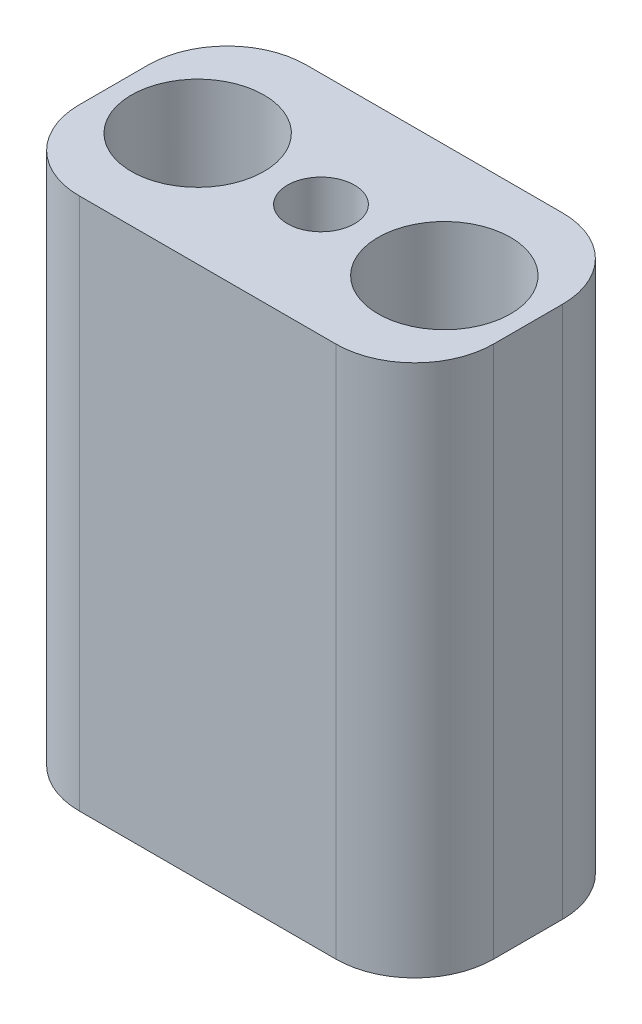
ISO-10303-21;
HEADER;
FILE_DESCRIPTION(('STEP AP214'),'2;1');
FILE_NAME('part.step','',(''),(''),'','','');
FILE_SCHEMA(('AUTOMOTIVE_DESIGN { 1 0 10303 214 1 1 1 1 }'));
ENDSEC;
DATA;
#1=APPLICATION_CONTEXT('core data for automotive mechanical design processes');
#2=APPLICATION_PROTOCOL_DEFINITION('international standard','automotive_design',2000,#1);
#3=PRODUCT_CONTEXT('',#1,'mechanical');
#4=PRODUCT('Part','Part','',(#3));
#5=PRODUCT_RELATED_PRODUCT_CATEGORY('part','',(#4));
#6=PRODUCT_DEFINITION_FORMATION('','',#4);
#7=PRODUCT_DEFINITION_CONTEXT('part definition',#1,'design');
#8=PRODUCT_DEFINITION('design','',#6,#7);
#9=PRODUCT_DEFINITION_SHAPE('','',#8);
#10=(LENGTH_UNIT() NAMED_UNIT(*) SI_UNIT(.MILLI.,.METRE.));
#11=(NAMED_UNIT(*) PLANE_ANGLE_UNIT() SI_UNIT($,.RADIAN.));
#12=(NAMED_UNIT(*) SI_UNIT($,.STERADIAN.) SOLID_ANGLE_UNIT());
#13=UNCERTAINTY_MEASURE_WITH_UNIT(LENGTH_MEASURE(1.E-05),#10,'distance_accuracy_value','');
#14=(GEOMETRIC_REPRESENTATION_CONTEXT(3) GLOBAL_UNCERTAINTY_ASSIGNED_CONTEXT((#13)) GLOBAL_UNIT_ASSIGNED_CONTEXT((#10,
#11,#12)) REPRESENTATION_CONTEXT('',''));
#15=CARTESIAN_POINT('',(0.,0.,0.));
#16=DIRECTION('',(0.,0.,1.));
#17=DIRECTION('',(1.,0.,0.));
#18=AXIS2_PLACEMENT_3D('',#15,#16,#17);
#19=CARTESIAN_POINT('',(-21.,0.,23.));
#20=DIRECTION('',(1.,0.,0.));
#21=DIRECTION('',(0.,0.,-1.));
#22=AXIS2_PLACEMENT_3D('',#19,#20,#21);
#23=PLANE('',#22);
#24=DIRECTION('',(0.,0.,-1.));
#25=VECTOR('',#24,1.);
#26=CARTESIAN_POINT('',(-21.,0.,23.));
#27=LINE('',#26,#25);
#28=CARTESIAN_POINT('',(-21.,0.,15.));
#29=VERTEX_POINT('',#28);
#30=CARTESIAN_POINT('',(-21.,0.,8.));
#31=VERTEX_POINT('',#30);
#32=EDGE_CURVE('E145',#29,#31,#27,.T.);
#33=ORIENTED_EDGE('',*,*,#32,.F.);
#34=DIRECTION('',(0.,-1.,0.));
#35=VECTOR('',#34,1.);
#36=CARTESIAN_POINT('',(-21.,0.,15.));
#37=LINE('',#36,#35);
#38=CARTESIAN_POINT('',(-21.,54.,15.));
#39=VERTEX_POINT('',#38);
#40=EDGE_CURVE('E165',#29,#39,#37,.F.);
#41=ORIENTED_EDGE('',*,*,#40,.T.);
#42=DIRECTION('',(0.,0.,-1.));
#43=VECTOR('',#42,1.);
#44=CARTESIAN_POINT('',(-21.,54.,23.));
#45=LINE('',#44,#43);
#46=CARTESIAN_POINT('',(-21.,54.,8.));
#47=VERTEX_POINT('',#46);
#48=EDGE_CURVE('E134',#39,#47,#45,.T.);
#49=ORIENTED_EDGE('',*,*,#48,.T.);
#50=DIRECTION('',(0.,-1.,0.));
#51=VECTOR('',#50,1.);
#52=CARTESIAN_POINT('',(-21.,0.,8.));
#53=LINE('',#52,#51);
#54=EDGE_CURVE('E162',#47,#31,#53,.T.);
#55=ORIENTED_EDGE('',*,*,#54,.T.);
#56=EDGE_LOOP('',(#33,#41,#49,#55));
#57=FACE_BOUND('',#56,.T.);
#58=ADVANCED_FACE('F41',(#57),#23,.F.);
#59=CARTESIAN_POINT('',(-21.,0.,23.));
#60=DIRECTION('',(0.,1.,0.));
#61=DIRECTION('',(0.,0.,1.));
#62=AXIS2_PLACEMENT_3D('',#59,#60,#61);
#63=PLANE('',#62);
#64=CARTESIAN_POINT('',(12.5,0.,11.5));
#65=DIRECTION('',(0.,1.,0.));
#66=DIRECTION('',(0.,0.,1.));
#67=AXIS2_PLACEMENT_3D('',#64,#65,#66);
#68=CIRCLE('',#67,3.29999999999999);
#69=CARTESIAN_POINT('',(12.5,0.,14.8));
#70=VERTEX_POINT('',#69);
#71=EDGE_CURVE('E278',#70,#70,#68,.T.);
#72=ORIENTED_EDGE('',*,*,#71,.T.);
#73=EDGE_LOOP('',(#72));
#74=FACE_BOUND('',#73,.T.);
#75=CARTESIAN_POINT('',(-12.5,0.,11.5));
#76=DIRECTION('',(0.,1.,0.));
#77=DIRECTION('',(0.,0.,1.));
#78=AXIS2_PLACEMENT_3D('',#75,#76,#77);
#79=CIRCLE('',#78,3.29999999999999);
#80=CARTESIAN_POINT('',(-12.5,0.,14.8));
#81=VERTEX_POINT('',#80);
#82=EDGE_CURVE('E125',#81,#81,#79,.T.);
#83=ORIENTED_EDGE('',*,*,#82,.T.);
#84=EDGE_LOOP('',(#83));
#85=FACE_BOUND('',#84,.T.);
#86=DIRECTION('',(1.,0.,0.));
#87=VECTOR('',#86,1.);
#88=CARTESIAN_POINT('',(-21.,0.,23.));
#89=LINE('',#88,#87);
#90=CARTESIAN_POINT('',(-13.,0.,23.));
#91=VERTEX_POINT('',#90);
#92=CARTESIAN_POINT('',(13.,0.,23.));
#93=VERTEX_POINT('',#92);
#94=EDGE_CURVE('E129',#91,#93,#89,.T.);
#95=ORIENTED_EDGE('',*,*,#94,.F.);
#96=CARTESIAN_POINT('',(-13.,0.,15.));
#97=DIRECTION('',(0.,1.,0.));
#98=DIRECTION('',(0.,0.,1.));
#99=AXIS2_PLACEMENT_3D('',#96,#97,#98);
#100=CIRCLE('',#99,8.);
#101=EDGE_CURVE('E160',#91,#29,#100,.F.);
#102=ORIENTED_EDGE('',*,*,#101,.T.);
#103=ORIENTED_EDGE('',*,*,#32,.T.);
#104=CARTESIAN_POINT('',(-13.,0.,8.));
#105=DIRECTION('',(0.,1.,0.));
#106=DIRECTION('',(0.,0.,1.));
#107=AXIS2_PLACEMENT_3D('',#104,#105,#106);
#108=CIRCLE('',#107,8.);
#109=CARTESIAN_POINT('',(-13.,0.,0.));
#110=VERTEX_POINT('',#109);
#111=EDGE_CURVE('E156',#31,#110,#108,.F.);
#112=ORIENTED_EDGE('',*,*,#111,.T.);
#113=DIRECTION('',(1.,0.,0.));
#114=VECTOR('',#113,1.);
#115=CARTESIAN_POINT('',(-21.,0.,0.));
#116=LINE('',#115,#114);
#117=CARTESIAN_POINT('',(13.,0.,0.));
#118=VERTEX_POINT('',#117);
#119=EDGE_CURVE('E118',#110,#118,#116,.T.);
#120=ORIENTED_EDGE('',*,*,#119,.T.);
#121=CARTESIAN_POINT('',(13.,0.,8.));
#122=DIRECTION('',(0.,1.,0.));
#123=DIRECTION('',(0.,0.,1.));
#124=AXIS2_PLACEMENT_3D('',#121,#122,#123);
#125=CIRCLE('',#124,8.);
#126=CARTESIAN_POINT('',(21.,0.,8.));
#127=VERTEX_POINT('',#126);
#128=EDGE_CURVE('E154',#118,#127,#125,.F.);
#129=ORIENTED_EDGE('',*,*,#128,.T.);
#130=DIRECTION('',(0.,0.,-1.));
#131=VECTOR('',#130,1.);
#132=CARTESIAN_POINT('',(21.,0.,23.));
#133=LINE('',#132,#131);
#134=CARTESIAN_POINT('',(21.,0.,15.));
#135=VERTEX_POINT('',#134);
#136=EDGE_CURVE('E142',#135,#127,#133,.T.);
#137=ORIENTED_EDGE('',*,*,#136,.F.);
#138=CARTESIAN_POINT('',(13.,0.,15.));
#139=DIRECTION('',(0.,1.,0.));
#140=DIRECTION('',(0.,0.,1.));
#141=AXIS2_PLACEMENT_3D('',#138,#139,#140);
#142=CIRCLE('',#141,8.);
#143=EDGE_CURVE('E158',#135,#93,#142,.F.);
#144=ORIENTED_EDGE('',*,*,#143,.T.);
#145=EDGE_LOOP('',(#95,#102,#103,#112,#120,#129,#137,#144));
#146=FACE_BOUND('',#145,.T.);
#147=ADVANCED_FACE('F183',(#74,#85,#146),#63,.F.);
#148=CARTESIAN_POINT('',(21.,0.,23.));
#149=DIRECTION('',(-1.,0.,0.));
#150=DIRECTION('',(0.,0.,1.));
#151=AXIS2_PLACEMENT_3D('',#148,#149,#150);
#152=PLANE('',#151);
#153=DIRECTION('',(0.,0.,-1.));
#154=VECTOR('',#153,1.);
#155=CARTESIAN_POINT('',(21.,54.,23.));
#156=LINE('',#155,#154);
#157=CARTESIAN_POINT('',(21.,54.,15.));
#158=VERTEX_POINT('',#157);
#159=CARTESIAN_POINT('',(21.,54.,8.));
#160=VERTEX_POINT('',#159);
#161=EDGE_CURVE('E140',#158,#160,#156,.T.);
#162=ORIENTED_EDGE('',*,*,#161,.F.);
#163=DIRECTION('',(0.,1.,0.));
#164=VECTOR('',#163,1.);
#165=CARTESIAN_POINT('',(21.,0.,15.));
#166=LINE('',#165,#164);
#167=EDGE_CURVE('E175',#158,#135,#166,.F.);
#168=ORIENTED_EDGE('',*,*,#167,.T.);
#169=ORIENTED_EDGE('',*,*,#136,.T.);
#170=DIRECTION('',(0.,1.,0.));
#171=VECTOR('',#170,1.);
#172=CARTESIAN_POINT('',(21.,54.,8.));
#173=LINE('',#172,#171);
#174=EDGE_CURVE('E173',#127,#160,#173,.T.);
#175=ORIENTED_EDGE('',*,*,#174,.T.);
#176=EDGE_LOOP('',(#162,#168,#169,#175));
#177=FACE_BOUND('',#176,.T.);
#178=ADVANCED_FACE('F186',(#177),#152,.F.);
#179=CARTESIAN_POINT('',(-21.,54.,23.));
#180=DIRECTION('',(0.,-1.,0.));
#181=DIRECTION('',(0.,0.,-1.));
#182=AXIS2_PLACEMENT_3D('',#179,#180,#181);
#183=PLANE('',#182);
#184=CARTESIAN_POINT('',(-12.5,54.,11.5));
#185=DIRECTION('',(0.,-1.,0.));
#186=DIRECTION('',(0.,0.,-1.));
#187=AXIS2_PLACEMENT_3D('',#184,#185,#186);
#188=CIRCLE('',#187,6.72);
#189=CARTESIAN_POINT('',(-12.5,54.,4.78));
#190=VERTEX_POINT('',#189);
#191=EDGE_CURVE('E261',#190,#190,#188,.T.);
#192=ORIENTED_EDGE('',*,*,#191,.T.);
#193=EDGE_LOOP('',(#192));
#194=FACE_BOUND('',#193,.T.);
#195=CARTESIAN_POINT('',(12.5,54.,11.5));
#196=DIRECTION('',(0.,-1.,0.));
#197=DIRECTION('',(0.,0.,-1.));
#198=AXIS2_PLACEMENT_3D('',#195,#196,#197);
#199=CIRCLE('',#198,6.72);
#200=CARTESIAN_POINT('',(12.5,54.,4.78));
#201=VERTEX_POINT('',#200);
#202=EDGE_CURVE('E266',#201,#201,#199,.T.);
#203=ORIENTED_EDGE('',*,*,#202,.T.);
#204=EDGE_LOOP('',(#203));
#205=FACE_BOUND('',#204,.T.);
#206=CARTESIAN_POINT('',(0.,54.,11.5));
#207=DIRECTION('',(0.,1.,0.));
#208=DIRECTION('',(0.,0.,1.));
#209=AXIS2_PLACEMENT_3D('',#206,#207,#208);
#210=CIRCLE('',#209,3.4);
#211=CARTESIAN_POINT('',(0.,54.,14.9));
#212=VERTEX_POINT('',#211);
#213=EDGE_CURVE('E119',#212,#212,#210,.T.);
#214=ORIENTED_EDGE('',*,*,#213,.F.);
#215=EDGE_LOOP('',(#214));
#216=FACE_BOUND('',#215,.T.);
#217=ORIENTED_EDGE('',*,*,#48,.F.);
#218=CARTESIAN_POINT('',(-13.,54.,15.));
#219=DIRECTION('',(0.,-1.,0.));
#220=DIRECTION('',(0.,0.,-1.));
#221=AXIS2_PLACEMENT_3D('',#218,#219,#220);
#222=CIRCLE('',#221,8.);
#223=CARTESIAN_POINT('',(-13.,54.,23.));
#224=VERTEX_POINT('',#223);
#225=EDGE_CURVE('E171',#39,#224,#222,.F.);
#226=ORIENTED_EDGE('',*,*,#225,.T.);
#227=DIRECTION('',(-1.,0.,0.));
#228=VECTOR('',#227,1.);
#229=CARTESIAN_POINT('',(-21.,54.,23.));
#230=LINE('',#229,#228);
#231=CARTESIAN_POINT('',(13.,54.,23.));
#232=VERTEX_POINT('',#231);
#233=EDGE_CURVE('E132',#232,#224,#230,.T.);
#234=ORIENTED_EDGE('',*,*,#233,.F.);
#235=CARTESIAN_POINT('',(13.,54.,15.));
#236=DIRECTION('',(0.,-1.,0.));
#237=DIRECTION('',(0.,0.,-1.));
#238=AXIS2_PLACEMENT_3D('',#235,#236,#237);
#239=CIRCLE('',#238,8.);
#240=EDGE_CURVE('E64',#232,#158,#239,.F.);
#241=ORIENTED_EDGE('',*,*,#240,.T.);
#242=ORIENTED_EDGE('',*,*,#161,.T.);
#243=CARTESIAN_POINT('',(13.,54.,8.));
#244=DIRECTION('',(0.,-1.,0.));
#245=DIRECTION('',(0.,0.,-1.));
#246=AXIS2_PLACEMENT_3D('',#243,#244,#245);
#247=CIRCLE('',#246,8.);
#248=CARTESIAN_POINT('',(13.,54.,0.));
#249=VERTEX_POINT('',#248);
#250=EDGE_CURVE('E56',#160,#249,#247,.F.);
#251=ORIENTED_EDGE('',*,*,#250,.T.);
#252=DIRECTION('',(-1.,0.,0.));
#253=VECTOR('',#252,1.);
#254=CARTESIAN_POINT('',(-21.,54.,0.));
#255=LINE('',#254,#253);
#256=CARTESIAN_POINT('',(-13.,54.,0.));
#257=VERTEX_POINT('',#256);
#258=EDGE_CURVE('E122',#249,#257,#255,.T.);
#259=ORIENTED_EDGE('',*,*,#258,.T.);
#260=CARTESIAN_POINT('',(-13.,54.,8.));
#261=DIRECTION('',(0.,-1.,0.));
#262=DIRECTION('',(0.,0.,-1.));
#263=AXIS2_PLACEMENT_3D('',#260,#261,#262);
#264=CIRCLE('',#263,8.);
#265=EDGE_CURVE('E168',#257,#47,#264,.F.);
#266=ORIENTED_EDGE('',*,*,#265,.T.);
#267=EDGE_LOOP('',(#217,#226,#234,#241,#242,#251,#259,#266));
#268=FACE_BOUND('',#267,.T.);
#269=ADVANCED_FACE('F189',(#194,#205,#216,#268),#183,.F.);
#270=CARTESIAN_POINT('',(0.,0.,23.));
#271=DIRECTION('',(0.,0.,-1.));
#272=DIRECTION('',(-1.,0.,0.));
#273=AXIS2_PLACEMENT_3D('',#270,#271,#272);
#274=PLANE('',#273);
#275=ORIENTED_EDGE('',*,*,#233,.T.);
#276=DIRECTION('',(0.,-1.,0.));
#277=VECTOR('',#276,1.);
#278=CARTESIAN_POINT('',(-13.,0.,23.));
#279=LINE('',#278,#277);
#280=EDGE_CURVE('E151',#224,#91,#279,.T.);
#281=ORIENTED_EDGE('',*,*,#280,.T.);
#282=ORIENTED_EDGE('',*,*,#94,.T.);
#283=DIRECTION('',(0.,1.,0.));
#284=VECTOR('',#283,1.);
#285=CARTESIAN_POINT('',(13.,0.,23.));
#286=LINE('',#285,#284);
#287=EDGE_CURVE('E148',#93,#232,#286,.T.);
#288=ORIENTED_EDGE('',*,*,#287,.T.);
#289=EDGE_LOOP('',(#275,#281,#282,#288));
#290=FACE_BOUND('',#289,.T.);
#291=ADVANCED_FACE('F202',(#290),#274,.F.);
#292=CARTESIAN_POINT('',(0.,0.,0.));
#293=DIRECTION('',(0.,0.,-1.));
#294=DIRECTION('',(-1.,0.,0.));
#295=AXIS2_PLACEMENT_3D('',#292,#293,#294);
#296=PLANE('',#295);
#297=ORIENTED_EDGE('',*,*,#119,.F.);
#298=DIRECTION('',(0.,-1.,0.));
#299=VECTOR('',#298,1.);
#300=CARTESIAN_POINT('',(-13.,54.,0.));
#301=LINE('',#300,#299);
#302=EDGE_CURVE('E11',#110,#257,#301,.F.);
#303=ORIENTED_EDGE('',*,*,#302,.T.);
#304=ORIENTED_EDGE('',*,*,#258,.F.);
#305=DIRECTION('',(0.,1.,0.));
#306=VECTOR('',#305,1.);
#307=CARTESIAN_POINT('',(13.,0.,0.));
#308=LINE('',#307,#306);
#309=EDGE_CURVE('E49',#249,#118,#308,.F.);
#310=ORIENTED_EDGE('',*,*,#309,.T.);
#311=EDGE_LOOP('',(#297,#303,#304,#310));
#312=FACE_BOUND('',#311,.T.);
#313=ADVANCED_FACE('F112',(#312),#296,.T.);
#314=CARTESIAN_POINT('',(0.,39.,11.5));
#315=DIRECTION('',(0.,1.,0.));
#316=DIRECTION('',(0.,0.,1.));
#317=AXIS2_PLACEMENT_3D('',#314,#315,#316);
#318=CONICAL_SURFACE('',#317,3.4,1.02974425867665);
#319=CARTESIAN_POINT('',(0.,36.9570738953063,11.5));
#320=VERTEX_POINT('',#319);
#321=VERTEX_LOOP('',#320);
#322=FACE_BOUND('',#321,.T.);
#323=CARTESIAN_POINT('',(0.,39.,11.5));
#324=DIRECTION('',(0.,1.,0.));
#325=DIRECTION('',(0.,0.,1.));
#326=AXIS2_PLACEMENT_3D('',#323,#324,#325);
#327=CIRCLE('',#326,3.4);
#328=CARTESIAN_POINT('',(0.,39.,14.9));
#329=VERTEX_POINT('',#328);
#330=EDGE_CURVE('E116',#329,#329,#327,.T.);
#331=ORIENTED_EDGE('',*,*,#330,.T.);
#332=EDGE_LOOP('',(#331));
#333=FACE_BOUND('',#332,.T.);
#334=ADVANCED_FACE('F108',(#322,#333),#318,.F.);
#335=CARTESIAN_POINT('',(0.,54.,11.5));
#336=DIRECTION('',(0.,1.,0.));
#337=DIRECTION('',(0.,0.,1.));
#338=AXIS2_PLACEMENT_3D('',#335,#336,#337);
#339=CYLINDRICAL_SURFACE('',#338,3.4);
#340=ORIENTED_EDGE('',*,*,#330,.F.);
#341=EDGE_LOOP('',(#340));
#342=FACE_BOUND('',#341,.T.);
#343=ORIENTED_EDGE('',*,*,#213,.T.);
#344=EDGE_LOOP('',(#343));
#345=FACE_BOUND('',#344,.T.);
#346=ADVANCED_FACE('F111',(#342,#345),#339,.F.);
#347=CARTESIAN_POINT('',(-12.5,35.,11.5));
#348=DIRECTION('',(0.,1.,0.));
#349=DIRECTION('',(0.,0.,1.));
#350=AXIS2_PLACEMENT_3D('',#347,#348,#349);
#351=CYLINDRICAL_SURFACE('',#350,3.29999999999999);
#352=ORIENTED_EDGE('',*,*,#82,.F.);
#353=EDGE_LOOP('',(#352));
#354=FACE_BOUND('',#353,.T.);
#355=CARTESIAN_POINT('',(-12.5,31.58,11.5));
#356=DIRECTION('',(0.,1.,0.));
#357=DIRECTION('',(0.,0.,1.));
#358=AXIS2_PLACEMENT_3D('',#355,#356,#357);
#359=CIRCLE('',#358,3.29999999999999);
#360=CARTESIAN_POINT('',(-12.5,31.58,14.8));
#361=VERTEX_POINT('',#360);
#362=EDGE_CURVE('E281',#361,#361,#359,.T.);
#363=ORIENTED_EDGE('',*,*,#362,.T.);
#364=EDGE_LOOP('',(#363));
#365=FACE_BOUND('',#364,.T.);
#366=ADVANCED_FACE('F234',(#354,#365),#351,.F.);
#367=CARTESIAN_POINT('',(-12.5,35.,11.5));
#368=DIRECTION('',(0.,1.,0.));
#369=DIRECTION('',(0.,0.,1.));
#370=AXIS2_PLACEMENT_3D('',#367,#368,#369);
#371=CONICAL_SURFACE('',#370,6.72,0.785398163397447);
#372=ORIENTED_EDGE('',*,*,#362,.F.);
#373=EDGE_LOOP('',(#372));
#374=FACE_BOUND('',#373,.T.);
#375=CARTESIAN_POINT('',(-12.5,35.,11.5));
#376=DIRECTION('',(0.,-1.,0.));
#377=DIRECTION('',(0.,0.,-1.));
#378=AXIS2_PLACEMENT_3D('',#375,#376,#377);
#379=CIRCLE('',#378,6.72);
#380=CARTESIAN_POINT('',(-12.5,35.,4.78));
#381=VERTEX_POINT('',#380);
#382=EDGE_CURVE('E264',#381,#381,#379,.T.);
#383=ORIENTED_EDGE('',*,*,#382,.F.);
#384=EDGE_LOOP('',(#383));
#385=FACE_BOUND('',#384,.T.);
#386=ADVANCED_FACE('F237',(#374,#385),#371,.F.);
#387=CARTESIAN_POINT('',(12.5,35.,11.5));
#388=DIRECTION('',(0.,1.,0.));
#389=DIRECTION('',(0.,0.,1.));
#390=AXIS2_PLACEMENT_3D('',#387,#388,#389);
#391=CYLINDRICAL_SURFACE('',#390,3.29999999999999);
#392=ORIENTED_EDGE('',*,*,#71,.F.);
#393=EDGE_LOOP('',(#392));
#394=FACE_BOUND('',#393,.T.);
#395=CARTESIAN_POINT('',(12.5,31.58,11.5));
#396=DIRECTION('',(0.,1.,0.));
#397=DIRECTION('',(0.,0.,1.));
#398=AXIS2_PLACEMENT_3D('',#395,#396,#397);
#399=CIRCLE('',#398,3.29999999999999);
#400=CARTESIAN_POINT('',(12.5,31.58,14.8));
#401=VERTEX_POINT('',#400);
#402=EDGE_CURVE('E268',#401,#401,#399,.T.);
#403=ORIENTED_EDGE('',*,*,#402,.T.);
#404=EDGE_LOOP('',(#403));
#405=FACE_BOUND('',#404,.T.);
#406=ADVANCED_FACE('F241',(#394,#405),#391,.F.);
#407=CARTESIAN_POINT('',(12.5,35.,11.5));
#408=DIRECTION('',(0.,1.,0.));
#409=DIRECTION('',(0.,0.,1.));
#410=AXIS2_PLACEMENT_3D('',#407,#408,#409);
#411=CONICAL_SURFACE('',#410,6.72,0.785398163397447);
#412=ORIENTED_EDGE('',*,*,#402,.F.);
#413=EDGE_LOOP('',(#412));
#414=FACE_BOUND('',#413,.T.);
#415=CARTESIAN_POINT('',(12.5,35.,11.5));
#416=DIRECTION('',(0.,-1.,0.));
#417=DIRECTION('',(0.,0.,-1.));
#418=AXIS2_PLACEMENT_3D('',#415,#416,#417);
#419=CIRCLE('',#418,6.72);
#420=CARTESIAN_POINT('',(12.5,35.,4.78));
#421=VERTEX_POINT('',#420);
#422=EDGE_CURVE('E271',#421,#421,#419,.T.);
#423=ORIENTED_EDGE('',*,*,#422,.F.);
#424=EDGE_LOOP('',(#423));
#425=FACE_BOUND('',#424,.T.);
#426=ADVANCED_FACE('F213',(#414,#425),#411,.F.);
#427=CARTESIAN_POINT('',(-13.,0.,15.));
#428=DIRECTION('',(0.,-1.,0.));
#429=DIRECTION('',(0.,0.,-1.));
#430=AXIS2_PLACEMENT_3D('',#427,#428,#429);
#431=CYLINDRICAL_SURFACE('',#430,8.);
#432=ORIENTED_EDGE('',*,*,#225,.F.);
#433=ORIENTED_EDGE('',*,*,#40,.F.);
#434=ORIENTED_EDGE('',*,*,#101,.F.);
#435=ORIENTED_EDGE('',*,*,#280,.F.);
#436=EDGE_LOOP('',(#432,#433,#434,#435));
#437=FACE_BOUND('',#436,.T.);
#438=ADVANCED_FACE('F200',(#437),#431,.T.);
#439=CARTESIAN_POINT('',(13.,0.,15.));
#440=DIRECTION('',(0.,1.,0.));
#441=DIRECTION('',(0.,0.,1.));
#442=AXIS2_PLACEMENT_3D('',#439,#440,#441);
#443=CYLINDRICAL_SURFACE('',#442,8.);
#444=ORIENTED_EDGE('',*,*,#143,.F.);
#445=ORIENTED_EDGE('',*,*,#167,.F.);
#446=ORIENTED_EDGE('',*,*,#240,.F.);
#447=ORIENTED_EDGE('',*,*,#287,.F.);
#448=EDGE_LOOP('',(#444,#445,#446,#447));
#449=FACE_BOUND('',#448,.T.);
#450=ADVANCED_FACE('F206',(#449),#443,.T.);
#451=CARTESIAN_POINT('',(-13.,0.,8.));
#452=DIRECTION('',(0.,1.,0.));
#453=DIRECTION('',(0.,0.,1.));
#454=AXIS2_PLACEMENT_3D('',#451,#452,#453);
#455=CYLINDRICAL_SURFACE('',#454,8.);
#456=ORIENTED_EDGE('',*,*,#265,.F.);
#457=ORIENTED_EDGE('',*,*,#302,.F.);
#458=ORIENTED_EDGE('',*,*,#111,.F.);
#459=ORIENTED_EDGE('',*,*,#54,.F.);
#460=EDGE_LOOP('',(#456,#457,#458,#459));
#461=FACE_BOUND('',#460,.T.);
#462=ADVANCED_FACE('F193',(#461),#455,.T.);
#463=CARTESIAN_POINT('',(13.,0.,8.));
#464=DIRECTION('',(0.,-1.,0.));
#465=DIRECTION('',(0.,0.,-1.));
#466=AXIS2_PLACEMENT_3D('',#463,#464,#465);
#467=CYLINDRICAL_SURFACE('',#466,8.);
#468=ORIENTED_EDGE('',*,*,#128,.F.);
#469=ORIENTED_EDGE('',*,*,#309,.F.);
#470=ORIENTED_EDGE('',*,*,#250,.F.);
#471=ORIENTED_EDGE('',*,*,#174,.F.);
#472=EDGE_LOOP('',(#468,#469,#470,#471));
#473=FACE_BOUND('',#472,.T.);
#474=ADVANCED_FACE('F43',(#473),#467,.T.);
#475=CARTESIAN_POINT('',(12.5,54.,11.5));
#476=DIRECTION('',(0.,-1.,0.));
#477=DIRECTION('',(0.,0.,-1.));
#478=AXIS2_PLACEMENT_3D('',#475,#476,#477);
#479=CYLINDRICAL_SURFACE('',#478,6.72);
#480=ORIENTED_EDGE('',*,*,#202,.F.);
#481=EDGE_LOOP('',(#480));
#482=FACE_BOUND('',#481,.T.);
#483=ORIENTED_EDGE('',*,*,#422,.T.);
#484=EDGE_LOOP('',(#483));
#485=FACE_BOUND('',#484,.T.);
#486=ADVANCED_FACE('F249',(#482,#485),#479,.F.);
#487=CARTESIAN_POINT('',(-12.5,54.,11.5));
#488=DIRECTION('',(0.,-1.,0.));
#489=DIRECTION('',(0.,0.,-1.));
#490=AXIS2_PLACEMENT_3D('',#487,#488,#489);
#491=CYLINDRICAL_SURFACE('',#490,6.72);
#492=ORIENTED_EDGE('',*,*,#191,.F.);
#493=EDGE_LOOP('',(#492));
#494=FACE_BOUND('',#493,.T.);
#495=ORIENTED_EDGE('',*,*,#382,.T.);
#496=EDGE_LOOP('',(#495));
#497=FACE_BOUND('',#496,.T.);
#498=ADVANCED_FACE('F252',(#494,#497),#491,.F.);
#499=CLOSED_SHELL('',(#58,#147,#178,#269,#291,#313,#334,#346,#366,#386,#406,#426,#438,#450,#462,
#474,#486,#498));
#500=MANIFOLD_SOLID_BREP('B2',#499);
#501=ADVANCED_BREP_SHAPE_REPRESENTATION('',(#18,#500),#14);
#502=SHAPE_DEFINITION_REPRESENTATION(#9,#501);
ENDSEC;
END-ISO-10303-21;
